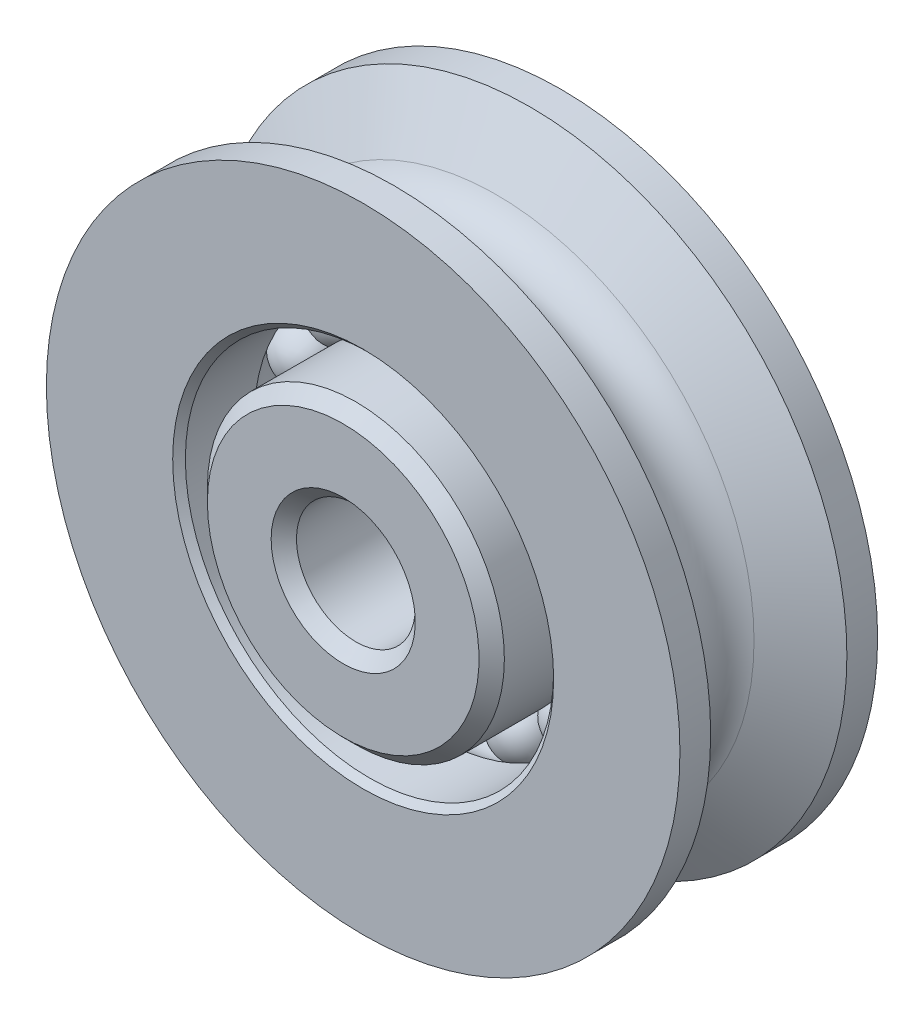
ISO-10303-21;
HEADER;
FILE_DESCRIPTION(('STEP AP214'),'2;1');
FILE_NAME('part.step','',(''),(''),'','','');
FILE_SCHEMA(('AUTOMOTIVE_DESIGN { 1 0 10303 214 1 1 1 1 }'));
ENDSEC;
DATA;
#1=APPLICATION_CONTEXT('core data for automotive mechanical design processes');
#2=APPLICATION_PROTOCOL_DEFINITION('international standard','automotive_design',2000,#1);
#3=PRODUCT_CONTEXT('',#1,'mechanical');
#4=PRODUCT('Part','Part','',(#3));
#5=PRODUCT_RELATED_PRODUCT_CATEGORY('part','',(#4));
#6=PRODUCT_DEFINITION_FORMATION('','',#4);
#7=PRODUCT_DEFINITION_CONTEXT('part definition',#1,'design');
#8=PRODUCT_DEFINITION('design','',#6,#7);
#9=PRODUCT_DEFINITION_SHAPE('','',#8);
#10=(LENGTH_UNIT() NAMED_UNIT(*) SI_UNIT(.MILLI.,.METRE.));
#11=(NAMED_UNIT(*) PLANE_ANGLE_UNIT() SI_UNIT($,.RADIAN.));
#12=(NAMED_UNIT(*) SI_UNIT($,.STERADIAN.) SOLID_ANGLE_UNIT());
#13=UNCERTAINTY_MEASURE_WITH_UNIT(LENGTH_MEASURE(1.E-05),#10,'distance_accuracy_value','');
#14=(GEOMETRIC_REPRESENTATION_CONTEXT(3) GLOBAL_UNCERTAINTY_ASSIGNED_CONTEXT((#13)) GLOBAL_UNIT_ASSIGNED_CONTEXT((#10,
#11,#12)) REPRESENTATION_CONTEXT('',''));
#15=CARTESIAN_POINT('',(0.,0.,0.));
#16=DIRECTION('',(0.,0.,1.));
#17=DIRECTION('',(1.,0.,0.));
#18=AXIS2_PLACEMENT_3D('',#15,#16,#17);
#19=CARTESIAN_POINT('',(2.55154178529415,6.15996678301904,0.));
#20=DIRECTION('',(0.382683432365077,0.923879532511292,0.));
#21=DIRECTION('',(0.,0.,-1.));
#22=AXIS2_PLACEMENT_3D('',#19,#20,#21);
#23=SPHERICAL_SURFACE('',#22,1.190625);
#24=CARTESIAN_POINT('',(3.00717424695382,7.2599608514153,0.));
#25=VERTEX_POINT('',#24);
#26=VERTEX_LOOP('',#25);
#27=FACE_BOUND('',#26,.T.);
#28=ADVANCED_FACE('F43',(#27),#23,.T.);
#29=CLOSED_SHELL('',(#28));
#30=MANIFOLD_SOLID_BREP('B2',#29);
#31=CARTESIAN_POINT('',(4.71463446356125,4.71463446356136,0.));
#32=DIRECTION('',(0.707106781186539,0.707106781186556,0.));
#33=DIRECTION('',(0.,0.,-1.));
#34=AXIS2_PLACEMENT_3D('',#31,#32,#33);
#35=SPHERICAL_SURFACE('',#34,1.190625);
#36=CARTESIAN_POINT('',(5.55653347491147,5.55653347491161,0.));
#37=VERTEX_POINT('',#36);
#38=VERTEX_LOOP('',#37);
#39=FACE_BOUND('',#38,.T.);
#40=ADVANCED_FACE('F61',(#39),#35,.T.);
#41=CLOSED_SHELL('',(#40));
#42=MANIFOLD_SOLID_BREP('B7',#41);
#43=CARTESIAN_POINT('',(6.15996678301898,2.5515417852943,0.));
#44=DIRECTION('',(0.923879532511283,0.3826834323651,0.));
#45=DIRECTION('',(0.,0.,-1.));
#46=AXIS2_PLACEMENT_3D('',#43,#44,#45);
#47=SPHERICAL_SURFACE('',#46,1.190625);
#48=CARTESIAN_POINT('',(7.25996085141522,3.007174246954,0.));
#49=VERTEX_POINT('',#48);
#50=VERTEX_LOOP('',#49);
#51=FACE_BOUND('',#50,.T.);
#52=ADVANCED_FACE('F79',(#51),#47,.T.);
#53=CLOSED_SHELL('',(#52));
#54=MANIFOLD_SOLID_BREP('B39',#53);
#55=CARTESIAN_POINT('',(6.6675,0.,0.));
#56=DIRECTION('',(1.,0.,0.));
#57=DIRECTION('',(0.,0.,-1.));
#58=AXIS2_PLACEMENT_3D('',#55,#56,#57);
#59=SPHERICAL_SURFACE('',#58,1.190625);
#60=CARTESIAN_POINT('',(7.858125,0.,0.));
#61=VERTEX_POINT('',#60);
#62=VERTEX_LOOP('',#61);
#63=FACE_BOUND('',#62,.T.);
#64=ADVANCED_FACE('F97',(#63),#59,.T.);
#65=CLOSED_SHELL('',(#64));
#66=MANIFOLD_SOLID_BREP('B57',#65);
#67=CARTESIAN_POINT('',(6.15996678301903,-2.55154178529417,0.));
#68=DIRECTION('',(0.923879532511291,-0.382683432365081,0.));
#69=DIRECTION('',(0.,0.,-1.));
#70=AXIS2_PLACEMENT_3D('',#67,#68,#69);
#71=SPHERICAL_SURFACE('',#70,1.190625);
#72=CARTESIAN_POINT('',(7.25996085141529,-3.00717424695385,0.));
#73=VERTEX_POINT('',#72);
#74=VERTEX_LOOP('',#73);
#75=FACE_BOUND('',#74,.T.);
#76=ADVANCED_FACE('F115',(#75),#71,.T.);
#77=CLOSED_SHELL('',(#76));
#78=MANIFOLD_SOLID_BREP('B75',#77);
#79=CARTESIAN_POINT('',(4.71463446356135,-4.71463446356126,0.));
#80=DIRECTION('',(0.707106781186554,-0.707106781186541,0.));
#81=DIRECTION('',(0.,0.,-1.));
#82=AXIS2_PLACEMENT_3D('',#79,#80,#81);
#83=SPHERICAL_SURFACE('',#82,1.190625);
#84=CARTESIAN_POINT('',(5.55653347491159,-5.55653347491149,0.));
#85=VERTEX_POINT('',#84);
#86=VERTEX_LOOP('',#85);
#87=FACE_BOUND('',#86,.T.);
#88=ADVANCED_FACE('F133',(#87),#83,.T.);
#89=CLOSED_SHELL('',(#88));
#90=MANIFOLD_SOLID_BREP('B93',#89);
#91=CARTESIAN_POINT('',(2.55154178529428,-6.15996678301898,0.));
#92=DIRECTION('',(0.382683432365097,-0.923879532511284,0.));
#93=DIRECTION('',(0.,0.,-1.));
#94=AXIS2_PLACEMENT_3D('',#91,#92,#93);
#95=SPHERICAL_SURFACE('',#94,1.190625);
#96=CARTESIAN_POINT('',(3.00717424695398,-7.25996085141523,0.));
#97=VERTEX_POINT('',#96);
#98=VERTEX_LOOP('',#97);
#99=FACE_BOUND('',#98,.T.);
#100=ADVANCED_FACE('F151',(#99),#95,.T.);
#101=CLOSED_SHELL('',(#100));
#102=MANIFOLD_SOLID_BREP('B111',#101);
#103=CARTESIAN_POINT('',(0.,-6.6675,0.));
#104=DIRECTION('',(0.,-1.,0.));
#105=DIRECTION('',(0.,0.,-1.));
#106=AXIS2_PLACEMENT_3D('',#103,#104,#105);
#107=SPHERICAL_SURFACE('',#106,1.190625);
#108=CARTESIAN_POINT('',(0.,-7.858125,0.));
#109=VERTEX_POINT('',#108);
#110=VERTEX_LOOP('',#109);
#111=FACE_BOUND('',#110,.T.);
#112=ADVANCED_FACE('F169',(#111),#107,.T.);
#113=CLOSED_SHELL('',(#112));
#114=MANIFOLD_SOLID_BREP('B129',#113);
#115=CARTESIAN_POINT('',(-2.5515417852942,-6.15996678301902,0.));
#116=DIRECTION('',(-0.382683432365084,-0.923879532511289,0.));
#117=DIRECTION('',(0.,0.,-1.));
#118=AXIS2_PLACEMENT_3D('',#115,#116,#117);
#119=SPHERICAL_SURFACE('',#118,1.190625);
#120=CARTESIAN_POINT('',(-3.00717424695388,-7.25996085141527,0.));
#121=VERTEX_POINT('',#120);
#122=VERTEX_LOOP('',#121);
#123=FACE_BOUND('',#122,.T.);
#124=ADVANCED_FACE('F187',(#123),#119,.T.);
#125=CLOSED_SHELL('',(#124));
#126=MANIFOLD_SOLID_BREP('B147',#125);
#127=CARTESIAN_POINT('',(-4.71463446356128,-4.71463446356133,0.));
#128=DIRECTION('',(-0.707106781186544,-0.707106781186551,0.));
#129=DIRECTION('',(0.,0.,-1.));
#130=AXIS2_PLACEMENT_3D('',#127,#128,#129);
#131=SPHERICAL_SURFACE('',#130,1.190625);
#132=CARTESIAN_POINT('',(-5.55653347491151,-5.55653347491157,0.));
#133=VERTEX_POINT('',#132);
#134=VERTEX_LOOP('',#133);
#135=FACE_BOUND('',#134,.T.);
#136=ADVANCED_FACE('F205',(#135),#131,.T.);
#137=CLOSED_SHELL('',(#136));
#138=MANIFOLD_SOLID_BREP('B165',#137);
#139=CARTESIAN_POINT('',(-6.15996678301899,-2.55154178529426,0.));
#140=DIRECTION('',(-0.923879532511285,-0.382683432365094,0.));
#141=DIRECTION('',(0.,0.,-1.));
#142=AXIS2_PLACEMENT_3D('',#139,#140,#141);
#143=SPHERICAL_SURFACE('',#142,1.190625);
#144=CARTESIAN_POINT('',(-7.25996085141524,-3.00717424695395,0.));
#145=VERTEX_POINT('',#144);
#146=VERTEX_LOOP('',#145);
#147=FACE_BOUND('',#146,.T.);
#148=ADVANCED_FACE('F223',(#147),#143,.T.);
#149=CLOSED_SHELL('',(#148));
#150=MANIFOLD_SOLID_BREP('B183',#149);
#151=CARTESIAN_POINT('',(-6.6675,0.,0.));
#152=DIRECTION('',(-1.,0.,0.));
#153=DIRECTION('',(0.,0.,-1.));
#154=AXIS2_PLACEMENT_3D('',#151,#152,#153);
#155=SPHERICAL_SURFACE('',#154,1.190625);
#156=CARTESIAN_POINT('',(-7.858125,0.,0.));
#157=VERTEX_POINT('',#156);
#158=VERTEX_LOOP('',#157);
#159=FACE_BOUND('',#158,.T.);
#160=ADVANCED_FACE('F241',(#159),#155,.T.);
#161=CLOSED_SHELL('',(#160));
#162=MANIFOLD_SOLID_BREP('B201',#161);
#163=CARTESIAN_POINT('',(-6.15996678301901,2.55154178529422,0.));
#164=DIRECTION('',(-0.923879532511288,0.382683432365087,0.));
#165=DIRECTION('',(0.,0.,-1.));
#166=AXIS2_PLACEMENT_3D('',#163,#164,#165);
#167=SPHERICAL_SURFACE('',#166,1.190625);
#168=CARTESIAN_POINT('',(-7.25996085141526,3.0071742469539,0.));
#169=VERTEX_POINT('',#168);
#170=VERTEX_LOOP('',#169);
#171=FACE_BOUND('',#170,.T.);
#172=ADVANCED_FACE('F259',(#171),#167,.T.);
#173=CLOSED_SHELL('',(#172));
#174=MANIFOLD_SOLID_BREP('B219',#173);
#175=CARTESIAN_POINT('',(-4.71463446356131,4.7146344635613,0.));
#176=DIRECTION('',(-0.707106781186549,0.707106781186546,0.));
#177=DIRECTION('',(0.,0.,-1.));
#178=AXIS2_PLACEMENT_3D('',#175,#176,#177);
#179=SPHERICAL_SURFACE('',#178,1.190625);
#180=CARTESIAN_POINT('',(-5.55653347491155,5.55653347491153,0.));
#181=VERTEX_POINT('',#180);
#182=VERTEX_LOOP('',#181);
#183=FACE_BOUND('',#182,.T.);
#184=ADVANCED_FACE('F277',(#183),#179,.T.);
#185=CLOSED_SHELL('',(#184));
#186=MANIFOLD_SOLID_BREP('B237',#185);
#187=CARTESIAN_POINT('',(-2.55154178529424,6.159966783019,0.));
#188=DIRECTION('',(-0.382683432365091,0.923879532511287,0.));
#189=DIRECTION('',(0.,0.,-1.));
#190=AXIS2_PLACEMENT_3D('',#187,#188,#189);
#191=SPHERICAL_SURFACE('',#190,1.190625);
#192=CARTESIAN_POINT('',(-3.00717424695393,7.25996085141525,0.));
#193=VERTEX_POINT('',#192);
#194=VERTEX_LOOP('',#193);
#195=FACE_BOUND('',#194,.T.);
#196=ADVANCED_FACE('F295',(#195),#191,.T.);
#197=CLOSED_SHELL('',(#196));
#198=MANIFOLD_SOLID_BREP('B255',#197);
#199=CARTESIAN_POINT('',(0.,6.6675,0.));
#200=DIRECTION('',(0.,1.,0.));
#201=DIRECTION('',(0.,0.,-1.));
#202=AXIS2_PLACEMENT_3D('',#199,#200,#201);
#203=SPHERICAL_SURFACE('',#202,1.190625);
#204=CARTESIAN_POINT('',(0.,7.858125,0.));
#205=VERTEX_POINT('',#204);
#206=VERTEX_LOOP('',#205);
#207=FACE_BOUND('',#206,.T.);
#208=ADVANCED_FACE('F315',(#207),#203,.T.);
#209=CLOSED_SHELL('',(#208));
#210=MANIFOLD_SOLID_BREP('B273',#209);
#211=CARTESIAN_POINT('',(0.,5.953125,4.7625));
#212=DIRECTION('',(0.,0.,-1.));
#213=DIRECTION('',(-1.,0.,0.));
#214=AXIS2_PLACEMENT_3D('',#211,#212,#213);
#215=PLANE('',#214);
#216=CARTESIAN_POINT('',(0.,0.,4.7625));
#217=DIRECTION('',(0.,0.,-1.));
#218=DIRECTION('',(-1.,0.,0.));
#219=AXIS2_PLACEMENT_3D('',#216,#217,#218);
#220=CIRCLE('',#219,5.445125);
#221=CARTESIAN_POINT('',(-5.445125,0.,4.7625));
#222=VERTEX_POINT('',#221);
#223=EDGE_CURVE('E341',#222,#222,#220,.F.);
#224=ORIENTED_EDGE('',*,*,#223,.T.);
#225=EDGE_LOOP('',(#224));
#226=FACE_BOUND('',#225,.T.);
#227=CARTESIAN_POINT('',(0.,0.,4.7625));
#228=DIRECTION('',(0.,0.,-1.));
#229=DIRECTION('',(-1.,0.,0.));
#230=AXIS2_PLACEMENT_3D('',#227,#228,#229);
#231=CIRCLE('',#230,2.88925);
#232=CARTESIAN_POINT('',(-2.88925,0.,4.7625));
#233=VERTEX_POINT('',#232);
#234=EDGE_CURVE('E345',#233,#233,#231,.T.);
#235=ORIENTED_EDGE('',*,*,#234,.T.);
#236=EDGE_LOOP('',(#235));
#237=FACE_BOUND('',#236,.T.);
#238=ADVANCED_FACE('F334',(#226,#237),#215,.F.);
#239=CARTESIAN_POINT('',(0.,0.,4.7625));
#240=DIRECTION('',(0.,0.,1.));
#241=DIRECTION('',(1.,0.,0.));
#242=AXIS2_PLACEMENT_3D('',#239,#240,#241);
#243=CYLINDRICAL_SURFACE('',#242,2.38125);
#244=CARTESIAN_POINT('',(0.,0.,-4.2545));
#245=DIRECTION('',(0.,0.,1.));
#246=DIRECTION('',(1.,0.,0.));
#247=AXIS2_PLACEMENT_3D('',#244,#245,#246);
#248=CIRCLE('',#247,2.38125);
#249=CARTESIAN_POINT('',(2.38125,0.,-4.2545));
#250=VERTEX_POINT('',#249);
#251=EDGE_CURVE('E354',#250,#250,#248,.F.);
#252=ORIENTED_EDGE('',*,*,#251,.T.);
#253=EDGE_LOOP('',(#252));
#254=FACE_BOUND('',#253,.T.);
#255=CARTESIAN_POINT('',(0.,0.,4.2545));
#256=DIRECTION('',(0.,0.,-1.));
#257=DIRECTION('',(-1.,0.,0.));
#258=AXIS2_PLACEMENT_3D('',#255,#256,#257);
#259=CIRCLE('',#258,2.38125);
#260=CARTESIAN_POINT('',(-2.38125,0.,4.2545));
#261=VERTEX_POINT('',#260);
#262=EDGE_CURVE('E357',#261,#261,#259,.F.);
#263=ORIENTED_EDGE('',*,*,#262,.T.);
#264=EDGE_LOOP('',(#263));
#265=FACE_BOUND('',#264,.T.);
#266=ADVANCED_FACE('F389',(#254,#265),#243,.F.);
#267=CARTESIAN_POINT('',(0.,5.953125,-4.7625));
#268=DIRECTION('',(0.,0.,1.));
#269=DIRECTION('',(1.,0.,0.));
#270=AXIS2_PLACEMENT_3D('',#267,#268,#269);
#271=PLANE('',#270);
#272=CARTESIAN_POINT('',(0.,0.,-4.7625));
#273=DIRECTION('',(0.,0.,1.));
#274=DIRECTION('',(1.,0.,0.));
#275=AXIS2_PLACEMENT_3D('',#272,#273,#274);
#276=CIRCLE('',#275,2.88925);
#277=CARTESIAN_POINT('',(2.88925,0.,-4.7625));
#278=VERTEX_POINT('',#277);
#279=EDGE_CURVE('E360',#278,#278,#276,.T.);
#280=ORIENTED_EDGE('',*,*,#279,.T.);
#281=EDGE_LOOP('',(#280));
#282=FACE_BOUND('',#281,.T.);
#283=CARTESIAN_POINT('',(0.,0.,-4.7625));
#284=DIRECTION('',(0.,0.,1.));
#285=DIRECTION('',(1.,0.,0.));
#286=AXIS2_PLACEMENT_3D('',#283,#284,#285);
#287=CIRCLE('',#286,5.445125);
#288=CARTESIAN_POINT('',(5.445125,0.,-4.7625));
#289=VERTEX_POINT('',#288);
#290=EDGE_CURVE('E363',#289,#289,#287,.F.);
#291=ORIENTED_EDGE('',*,*,#290,.T.);
#292=EDGE_LOOP('',(#291));
#293=FACE_BOUND('',#292,.T.);
#294=ADVANCED_FACE('F383',(#282,#293),#271,.F.);
#295=CARTESIAN_POINT('',(0.,0.,4.7625));
#296=DIRECTION('',(0.,0.,1.));
#297=DIRECTION('',(1.,0.,0.));
#298=AXIS2_PLACEMENT_3D('',#295,#296,#297);
#299=CYLINDRICAL_SURFACE('',#298,5.953125);
#300=CARTESIAN_POINT('',(0.,0.,-4.2545));
#301=DIRECTION('',(0.,0.,1.));
#302=DIRECTION('',(1.,0.,0.));
#303=AXIS2_PLACEMENT_3D('',#300,#301,#302);
#304=CIRCLE('',#303,5.953125);
#305=CARTESIAN_POINT('',(5.953125,0.,-4.2545));
#306=VERTEX_POINT('',#305);
#307=EDGE_CURVE('E349',#306,#306,#304,.T.);
#308=ORIENTED_EDGE('',*,*,#307,.T.);
#309=EDGE_LOOP('',(#308));
#310=FACE_BOUND('',#309,.T.);
#311=CARTESIAN_POINT('',(0.,0.,-0.9525));
#312=DIRECTION('',(0.,0.,1.));
#313=DIRECTION('',(1.,0.,0.));
#314=AXIS2_PLACEMENT_3D('',#311,#312,#313);
#315=CIRCLE('',#314,5.953125);
#316=CARTESIAN_POINT('',(5.953125,0.,-0.9525));
#317=VERTEX_POINT('',#316);
#318=EDGE_CURVE('E366',#317,#317,#315,.T.);
#319=ORIENTED_EDGE('',*,*,#318,.F.);
#320=EDGE_LOOP('',(#319));
#321=FACE_BOUND('',#320,.T.);
#322=ADVANCED_FACE('F378',(#310,#321),#299,.T.);
#323=CARTESIAN_POINT('',(0.,0.,0.));
#324=DIRECTION('',(0.,0.,1.));
#325=DIRECTION('',(1.,0.,0.));
#326=AXIS2_PLACEMENT_3D('',#323,#324,#325);
#327=TOROIDAL_SURFACE('',#326,6.6675,1.190625);
#328=CARTESIAN_POINT('',(0.,0.,0.9525));
#329=DIRECTION('',(0.,0.,1.));
#330=DIRECTION('',(1.,0.,0.));
#331=AXIS2_PLACEMENT_3D('',#328,#329,#330);
#332=CIRCLE('',#331,5.953125);
#333=CARTESIAN_POINT('',(5.953125,0.,0.9525));
#334=VERTEX_POINT('',#333);
#335=EDGE_CURVE('E369',#334,#334,#332,.T.);
#336=ORIENTED_EDGE('',*,*,#335,.F.);
#337=EDGE_LOOP('',(#336));
#338=FACE_BOUND('',#337,.T.);
#339=ORIENTED_EDGE('',*,*,#318,.T.);
#340=EDGE_LOOP('',(#339));
#341=FACE_BOUND('',#340,.T.);
#342=ADVANCED_FACE('F375',(#338,#341),#327,.F.);
#343=CARTESIAN_POINT('',(0.,0.,4.7625));
#344=DIRECTION('',(0.,0.,1.));
#345=DIRECTION('',(1.,0.,0.));
#346=AXIS2_PLACEMENT_3D('',#343,#344,#345);
#347=CYLINDRICAL_SURFACE('',#346,5.953125);
#348=CARTESIAN_POINT('',(0.,0.,4.2545));
#349=DIRECTION('',(0.,0.,-1.));
#350=DIRECTION('',(-1.,0.,0.));
#351=AXIS2_PLACEMENT_3D('',#348,#349,#350);
#352=CIRCLE('',#351,5.953125);
#353=CARTESIAN_POINT('',(-5.953125,0.,4.2545));
#354=VERTEX_POINT('',#353);
#355=EDGE_CURVE('E314',#354,#354,#352,.T.);
#356=ORIENTED_EDGE('',*,*,#355,.T.);
#357=EDGE_LOOP('',(#356));
#358=FACE_BOUND('',#357,.T.);
#359=ORIENTED_EDGE('',*,*,#335,.T.);
#360=EDGE_LOOP('',(#359));
#361=FACE_BOUND('',#360,.T.);
#362=ADVANCED_FACE('F373',(#358,#361),#347,.T.);
#363=CARTESIAN_POINT('',(0.,0.,-4.7625));
#364=DIRECTION('',(0.,0.,-1.));
#365=DIRECTION('',(-1.,0.,0.));
#366=AXIS2_PLACEMENT_3D('',#363,#364,#365);
#367=CONICAL_SURFACE('',#366,2.88925,0.785398163397443);
#368=ORIENTED_EDGE('',*,*,#251,.F.);
#369=EDGE_LOOP('',(#368));
#370=FACE_BOUND('',#369,.T.);
#371=ORIENTED_EDGE('',*,*,#279,.F.);
#372=EDGE_LOOP('',(#371));
#373=FACE_BOUND('',#372,.T.);
#374=ADVANCED_FACE('F401',(#370,#373),#367,.F.);
#375=CARTESIAN_POINT('',(0.,0.,-4.2545));
#376=DIRECTION('',(0.,0.,1.));
#377=DIRECTION('',(1.,0.,0.));
#378=AXIS2_PLACEMENT_3D('',#375,#376,#377);
#379=CONICAL_SURFACE('',#378,5.953125,0.785398163397451);
#380=ORIENTED_EDGE('',*,*,#290,.F.);
#381=EDGE_LOOP('',(#380));
#382=FACE_BOUND('',#381,.T.);
#383=ORIENTED_EDGE('',*,*,#307,.F.);
#384=EDGE_LOOP('',(#383));
#385=FACE_BOUND('',#384,.T.);
#386=ADVANCED_FACE('F404',(#382,#385),#379,.T.);
#387=CARTESIAN_POINT('',(0.,0.,4.7625));
#388=DIRECTION('',(0.,0.,-1.));
#389=DIRECTION('',(-1.,0.,0.));
#390=AXIS2_PLACEMENT_3D('',#387,#388,#389);
#391=CONICAL_SURFACE('',#390,5.445125,0.785398163397444);
#392=CARTESIAN_POINT('',(-5.953125,0.,4.2545));
#393=CARTESIAN_POINT('',(-5.94783333333333,0.,4.25979166666666));
#394=CARTESIAN_POINT('',(-5.94254166666667,0.,4.26508333333333));
#395=CARTESIAN_POINT('',(-5.93195833333333,0.,4.27566666666666));
#396=CARTESIAN_POINT('',(-5.92666666666667,0.,4.28095833333333));
#397=CARTESIAN_POINT('',(-5.91608333333333,0.,4.29154166666666));
#398=CARTESIAN_POINT('',(-5.91079166666667,0.,4.29683333333333));
#399=CARTESIAN_POINT('',(-5.90020833333333,0.,4.30741666666666));
#400=CARTESIAN_POINT('',(-5.89491666666667,0.,4.31270833333333));
#401=CARTESIAN_POINT('',(-5.88433333333333,0.,4.32329166666666));
#402=CARTESIAN_POINT('',(-5.87904166666667,0.,4.32858333333333));
#403=CARTESIAN_POINT('',(-5.86845833333333,0.,4.33916666666666));
#404=CARTESIAN_POINT('',(-5.86316666666667,0.,4.34445833333333));
#405=CARTESIAN_POINT('',(-5.85258333333333,0.,4.35504166666666));
#406=CARTESIAN_POINT('',(-5.84729166666667,0.,4.36033333333333));
#407=CARTESIAN_POINT('',(-5.83670833333333,0.,4.37091666666666));
#408=CARTESIAN_POINT('',(-5.83141666666667,0.,4.37620833333333));
#409=CARTESIAN_POINT('',(-5.82083333333333,0.,4.38679166666666));
#410=CARTESIAN_POINT('',(-5.81554166666667,0.,4.39208333333333));
#411=CARTESIAN_POINT('',(-5.80495833333333,0.,4.40266666666666));
#412=CARTESIAN_POINT('',(-5.79966666666667,0.,4.40795833333333));
#413=CARTESIAN_POINT('',(-5.78908333333333,0.,4.41854166666667));
#414=CARTESIAN_POINT('',(-5.78379166666667,0.,4.42383333333333));
#415=CARTESIAN_POINT('',(-5.77320833333333,0.,4.43441666666667));
#416=CARTESIAN_POINT('',(-5.76791666666667,0.,4.43970833333333));
#417=CARTESIAN_POINT('',(-5.75733333333333,0.,4.45029166666667));
#418=CARTESIAN_POINT('',(-5.75204166666667,0.,4.45558333333333));
#419=CARTESIAN_POINT('',(-5.74145833333333,0.,4.46616666666667));
#420=CARTESIAN_POINT('',(-5.73616666666667,0.,4.47145833333333));
#421=CARTESIAN_POINT('',(-5.72558333333333,0.,4.48204166666667));
#422=CARTESIAN_POINT('',(-5.72029166666667,0.,4.48733333333333));
#423=CARTESIAN_POINT('',(-5.70970833333333,0.,4.49791666666667));
#424=CARTESIAN_POINT('',(-5.70441666666667,0.,4.50320833333333));
#425=CARTESIAN_POINT('',(-5.69383333333333,0.,4.51379166666667));
#426=CARTESIAN_POINT('',(-5.68854166666667,0.,4.51908333333333));
#427=CARTESIAN_POINT('',(-5.67795833333333,0.,4.52966666666667));
#428=CARTESIAN_POINT('',(-5.67266666666667,0.,4.53495833333333));
#429=CARTESIAN_POINT('',(-5.66208333333333,0.,4.54554166666667));
#430=CARTESIAN_POINT('',(-5.65679166666667,0.,4.55083333333333));
#431=CARTESIAN_POINT('',(-5.64620833333333,0.,4.56141666666667));
#432=CARTESIAN_POINT('',(-5.64091666666667,0.,4.56670833333333));
#433=CARTESIAN_POINT('',(-5.63033333333333,0.,4.57729166666667));
#434=CARTESIAN_POINT('',(-5.62504166666667,0.,4.58258333333333));
#435=CARTESIAN_POINT('',(-5.61445833333333,0.,4.59316666666667));
#436=CARTESIAN_POINT('',(-5.60916666666667,0.,4.59845833333333));
#437=CARTESIAN_POINT('',(-5.59858333333333,0.,4.60904166666667));
#438=CARTESIAN_POINT('',(-5.59329166666667,0.,4.61433333333333));
#439=CARTESIAN_POINT('',(-5.58270833333333,0.,4.62491666666667));
#440=CARTESIAN_POINT('',(-5.57741666666667,0.,4.63020833333333));
#441=CARTESIAN_POINT('',(-5.56683333333333,0.,4.64079166666667));
#442=CARTESIAN_POINT('',(-5.56154166666667,0.,4.64608333333333));
#443=CARTESIAN_POINT('',(-5.55095833333333,0.,4.65666666666667));
#444=CARTESIAN_POINT('',(-5.54566666666667,0.,4.66195833333333));
#445=CARTESIAN_POINT('',(-5.53508333333333,0.,4.67254166666667));
#446=CARTESIAN_POINT('',(-5.52979166666667,0.,4.67783333333333));
#447=CARTESIAN_POINT('',(-5.51920833333333,0.,4.68841666666667));
#448=CARTESIAN_POINT('',(-5.51391666666667,0.,4.69370833333333));
#449=CARTESIAN_POINT('',(-5.50333333333333,0.,4.70429166666667));
#450=CARTESIAN_POINT('',(-5.49804166666667,0.,4.70958333333333));
#451=CARTESIAN_POINT('',(-5.48745833333333,0.,4.72016666666667));
#452=CARTESIAN_POINT('',(-5.48216666666667,0.,4.72545833333333));
#453=CARTESIAN_POINT('',(-5.47158333333333,0.,4.73604166666667));
#454=CARTESIAN_POINT('',(-5.46629166666667,0.,4.74133333333334));
#455=CARTESIAN_POINT('',(-5.45570833333333,0.,4.75191666666667));
#456=CARTESIAN_POINT('',(-5.45041666666667,0.,4.75720833333333));
#457=CARTESIAN_POINT('',(-5.445125,0.,4.7625));
#458=B_SPLINE_CURVE_WITH_KNOTS('',3,(#392,#393,#394,#395,#396,#397,#398,#399,#400,#401,#402,
#403,#404,#405,#406,#407,#408,#409,#410,#411,#412,#413,#414,#415,#416,#417,#418,#419,#420,#421,
#422,#423,#424,#425,#426,#427,#428,#429,#430,#431,#432,#433,#434,#435,#436,#437,#438,#439,#440,
#441,#442,#443,#444,#445,#446,#447,#448,#449,#450,#451,#452,#453,#454,#455,#456,#457),
.UNSPECIFIED.,.F.,.F.,(4,2,2,2,2,2,2,2,2,2,2,2,2,2,2,2,2,2,2,2,2,2,2,2,2,2,2,2,2,2,2,2,4),(0.,
0.0224506403026733,0.0449012806053465,0.0673519209080192,0.0898025612106924,0.112253201513366,
0.134703841816038,0.157154482118711,0.179605122421384,0.202055762724057,0.22450640302673,
0.246957043329403,0.269407683632077,0.291858323934749,0.314308964237422,0.336759604540095,
0.359210244842768,0.381660885145441,0.404111525448114,0.426562165750786,0.44901280605346,
0.471463446356133,0.493914086658806,0.516364726961479,0.538815367264152,0.561266007566825,
0.583716647869497,0.606167288172171,0.628617928474844,0.651068568777517,0.67351920908019,
0.695969849382863,0.718420489685535),.UNSPECIFIED.);
#459=EDGE_CURVE('BSEAM407',#354,#222,#458,.T.);
#460=ORIENTED_EDGE('',*,*,#355,.F.);
#461=ORIENTED_EDGE('',*,*,#223,.F.);
#462=ORIENTED_EDGE('',*,*,#459,.T.);
#463=ORIENTED_EDGE('',*,*,#459,.F.);
#464=EDGE_LOOP('',(#460,#462,#461,#463));
#465=FACE_BOUND('',#464,.T.);
#466=ADVANCED_FACE('F407',(#465),#391,.T.);
#467=CARTESIAN_POINT('',(0.,0.,4.2545));
#468=DIRECTION('',(0.,0.,1.));
#469=DIRECTION('',(1.,0.,0.));
#470=AXIS2_PLACEMENT_3D('',#467,#468,#469);
#471=CONICAL_SURFACE('',#470,2.38125,0.785398163397448);
#472=ORIENTED_EDGE('',*,*,#234,.F.);
#473=EDGE_LOOP('',(#472));
#474=FACE_BOUND('',#473,.T.);
#475=ORIENTED_EDGE('',*,*,#262,.F.);
#476=EDGE_LOOP('',(#475));
#477=FACE_BOUND('',#476,.T.);
#478=ADVANCED_FACE('F336',(#474,#477),#471,.F.);
#479=CLOSED_SHELL('',(#238,#266,#294,#322,#342,#362,#374,#386,#466,#478));
#480=MANIFOLD_SOLID_BREP('B291',#479);
#481=CARTESIAN_POINT('',(0.,0.,0.));
#482=DIRECTION('',(0.,0.,1.));
#483=DIRECTION('',(1.,0.,0.));
#484=AXIS2_PLACEMENT_3D('',#481,#482,#483);
#485=TOROIDAL_SURFACE('',#484,11.1125,1.5875);
#486=CARTESIAN_POINT('',(0.,0.,1.37959781729992));
#487=DIRECTION('',(0.,0.,1.));
#488=DIRECTION('',(1.,0.,0.));
#489=AXIS2_PLACEMENT_3D('',#486,#487,#488);
#490=CIRCLE('',#489,10.3270917542441);
#491=CARTESIAN_POINT('',(10.3270917542441,0.,1.37959781729992));
#492=VERTEX_POINT('',#491);
#493=EDGE_CURVE('E505',#492,#492,#490,.T.);
#494=ORIENTED_EDGE('',*,*,#493,.F.);
#495=EDGE_LOOP('',(#494));
#496=FACE_BOUND('',#495,.T.);
#497=CARTESIAN_POINT('',(0.,0.,-1.37959781729992));
#498=DIRECTION('',(0.,0.,1.));
#499=DIRECTION('',(1.,0.,0.));
#500=AXIS2_PLACEMENT_3D('',#497,#498,#499);
#501=CIRCLE('',#500,10.3270917542441);
#502=CARTESIAN_POINT('',(10.3270917542441,0.,-1.37959781729992));
#503=VERTEX_POINT('',#502);
#504=EDGE_CURVE('E526',#503,#503,#501,.T.);
#505=ORIENTED_EDGE('',*,*,#504,.T.);
#506=EDGE_LOOP('',(#505));
#507=FACE_BOUND('',#506,.T.);
#508=ADVANCED_FACE('F485',(#496,#507),#485,.F.);
#509=CARTESIAN_POINT('',(0.,0.,1.37959781729992));
#510=DIRECTION('',(0.,0.,1.));
#511=DIRECTION('',(1.,0.,0.));
#512=AXIS2_PLACEMENT_3D('',#509,#510,#511);
#513=CONICAL_SURFACE('',#512,10.3270917542441,1.0532545428675);
#514=CARTESIAN_POINT('',(0.,0.,2.7305));
#515=DIRECTION('',(0.,0.,1.));
#516=DIRECTION('',(1.,0.,0.));
#517=AXIS2_PLACEMENT_3D('',#514,#515,#516);
#518=CIRCLE('',#517,12.7);
#519=CARTESIAN_POINT('',(12.7,0.,2.7305));
#520=VERTEX_POINT('',#519);
#521=EDGE_CURVE('E508',#520,#520,#518,.T.);
#522=ORIENTED_EDGE('',*,*,#521,.F.);
#523=EDGE_LOOP('',(#522));
#524=FACE_BOUND('',#523,.T.);
#525=ORIENTED_EDGE('',*,*,#493,.T.);
#526=EDGE_LOOP('',(#525));
#527=FACE_BOUND('',#526,.T.);
#528=ADVANCED_FACE('F556',(#524,#527),#513,.T.);
#529=CARTESIAN_POINT('',(0.,0.,4.7625));
#530=DIRECTION('',(0.,0.,1.));
#531=DIRECTION('',(1.,0.,0.));
#532=AXIS2_PLACEMENT_3D('',#529,#530,#531);
#533=CYLINDRICAL_SURFACE('',#532,12.7);
#534=CARTESIAN_POINT('',(0.,0.,3.9624));
#535=DIRECTION('',(0.,0.,1.));
#536=DIRECTION('',(1.,0.,0.));
#537=AXIS2_PLACEMENT_3D('',#534,#535,#536);
#538=CIRCLE('',#537,12.7);
#539=CARTESIAN_POINT('',(12.7,0.,3.9624));
#540=VERTEX_POINT('',#539);
#541=EDGE_CURVE('E511',#540,#540,#538,.T.);
#542=ORIENTED_EDGE('',*,*,#541,.F.);
#543=EDGE_LOOP('',(#542));
#544=FACE_BOUND('',#543,.T.);
#545=ORIENTED_EDGE('',*,*,#521,.T.);
#546=EDGE_LOOP('',(#545));
#547=FACE_BOUND('',#546,.T.);
#548=ADVANCED_FACE('F562',(#544,#547),#533,.T.);
#549=CARTESIAN_POINT('',(0.,7.381875,3.9624));
#550=DIRECTION('',(0.,0.,-1.));
#551=DIRECTION('',(-1.,0.,0.));
#552=AXIS2_PLACEMENT_3D('',#549,#550,#551);
#553=PLANE('',#552);
#554=CARTESIAN_POINT('',(0.,0.,3.9624));
#555=DIRECTION('',(0.,0.,-1.));
#556=DIRECTION('',(-1.,0.,0.));
#557=AXIS2_PLACEMENT_3D('',#554,#555,#556);
#558=CIRCLE('',#557,7.63587500000001);
#559=CARTESIAN_POINT('',(-7.63587500000001,0.,3.9624));
#560=VERTEX_POINT('',#559);
#561=EDGE_CURVE('E333',#560,#560,#558,.T.);
#562=ORIENTED_EDGE('',*,*,#561,.T.);
#563=EDGE_LOOP('',(#562));
#564=FACE_BOUND('',#563,.T.);
#565=ORIENTED_EDGE('',*,*,#541,.T.);
#566=EDGE_LOOP('',(#565));
#567=FACE_BOUND('',#566,.T.);
#568=ADVANCED_FACE('F586',(#564,#567),#553,.F.);
#569=CARTESIAN_POINT('',(0.,0.,4.7625));
#570=DIRECTION('',(0.,0.,1.));
#571=DIRECTION('',(1.,0.,0.));
#572=AXIS2_PLACEMENT_3D('',#569,#570,#571);
#573=CYLINDRICAL_SURFACE('',#572,7.381875);
#574=CARTESIAN_POINT('',(0.,0.,3.70839999999999));
#575=DIRECTION('',(0.,0.,-1.));
#576=DIRECTION('',(-1.,0.,0.));
#577=AXIS2_PLACEMENT_3D('',#574,#575,#576);
#578=CIRCLE('',#577,7.381875);
#579=CARTESIAN_POINT('',(-7.381875,0.,3.70839999999999));
#580=VERTEX_POINT('',#579);
#581=EDGE_CURVE('E492',#580,#580,#578,.F.);
#582=ORIENTED_EDGE('',*,*,#581,.T.);
#583=EDGE_LOOP('',(#582));
#584=FACE_BOUND('',#583,.T.);
#585=CARTESIAN_POINT('',(0.,0.,0.9525));
#586=DIRECTION('',(0.,0.,1.));
#587=DIRECTION('',(1.,0.,0.));
#588=AXIS2_PLACEMENT_3D('',#585,#586,#587);
#589=CIRCLE('',#588,7.381875);
#590=CARTESIAN_POINT('',(7.381875,0.,0.9525));
#591=VERTEX_POINT('',#590);
#592=EDGE_CURVE('E514',#591,#591,#589,.T.);
#593=ORIENTED_EDGE('',*,*,#592,.F.);
#594=EDGE_LOOP('',(#593));
#595=FACE_BOUND('',#594,.T.);
#596=ADVANCED_FACE('F581',(#584,#595),#573,.F.);
#597=CARTESIAN_POINT('',(0.,0.,0.));
#598=DIRECTION('',(0.,0.,1.));
#599=DIRECTION('',(1.,0.,0.));
#600=AXIS2_PLACEMENT_3D('',#597,#598,#599);
#601=TOROIDAL_SURFACE('',#600,6.6675,1.190625);
#602=CARTESIAN_POINT('',(0.,0.,-0.9525));
#603=DIRECTION('',(0.,0.,1.));
#604=DIRECTION('',(1.,0.,0.));
#605=AXIS2_PLACEMENT_3D('',#602,#603,#604);
#606=CIRCLE('',#605,7.381875);
#607=CARTESIAN_POINT('',(7.381875,0.,-0.9525));
#608=VERTEX_POINT('',#607);
#609=EDGE_CURVE('E517',#608,#608,#606,.T.);
#610=ORIENTED_EDGE('',*,*,#609,.F.);
#611=EDGE_LOOP('',(#610));
#612=FACE_BOUND('',#611,.T.);
#613=ORIENTED_EDGE('',*,*,#592,.T.);
#614=EDGE_LOOP('',(#613));
#615=FACE_BOUND('',#614,.T.);
#616=ADVANCED_FACE('F552',(#612,#615),#601,.F.);
#617=CARTESIAN_POINT('',(0.,0.,4.7625));
#618=DIRECTION('',(0.,0.,1.));
#619=DIRECTION('',(1.,0.,0.));
#620=AXIS2_PLACEMENT_3D('',#617,#618,#619);
#621=CYLINDRICAL_SURFACE('',#620,7.381875);
#622=CARTESIAN_POINT('',(0.,0.,-3.7084));
#623=DIRECTION('',(0.,0.,1.));
#624=DIRECTION('',(1.,0.,0.));
#625=AXIS2_PLACEMENT_3D('',#622,#623,#624);
#626=CIRCLE('',#625,7.381875);
#627=CARTESIAN_POINT('',(7.381875,0.,-3.7084));
#628=VERTEX_POINT('',#627);
#629=EDGE_CURVE('E496',#628,#628,#626,.F.);
#630=ORIENTED_EDGE('',*,*,#629,.T.);
#631=EDGE_LOOP('',(#630));
#632=FACE_BOUND('',#631,.T.);
#633=ORIENTED_EDGE('',*,*,#609,.T.);
#634=EDGE_LOOP('',(#633));
#635=FACE_BOUND('',#634,.T.);
#636=ADVANCED_FACE('F546',(#632,#635),#621,.F.);
#637=CARTESIAN_POINT('',(0.,12.7,-3.9624));
#638=DIRECTION('',(0.,0.,1.));
#639=DIRECTION('',(1.,0.,0.));
#640=AXIS2_PLACEMENT_3D('',#637,#638,#639);
#641=PLANE('',#640);
#642=CARTESIAN_POINT('',(0.,0.,-3.9624));
#643=DIRECTION('',(0.,0.,1.));
#644=DIRECTION('',(1.,0.,0.));
#645=AXIS2_PLACEMENT_3D('',#642,#643,#644);
#646=CIRCLE('',#645,7.63587500000001);
#647=CARTESIAN_POINT('',(7.63587500000001,0.,-3.9624));
#648=VERTEX_POINT('',#647);
#649=EDGE_CURVE('E500',#648,#648,#646,.T.);
#650=ORIENTED_EDGE('',*,*,#649,.T.);
#651=EDGE_LOOP('',(#650));
#652=FACE_BOUND('',#651,.T.);
#653=CARTESIAN_POINT('',(0.,0.,-3.9624));
#654=DIRECTION('',(0.,0.,1.));
#655=DIRECTION('',(1.,0.,0.));
#656=AXIS2_PLACEMENT_3D('',#653,#654,#655);
#657=CIRCLE('',#656,12.7);
#658=CARTESIAN_POINT('',(12.7,0.,-3.9624));
#659=VERTEX_POINT('',#658);
#660=EDGE_CURVE('E520',#659,#659,#657,.T.);
#661=ORIENTED_EDGE('',*,*,#660,.F.);
#662=EDGE_LOOP('',(#661));
#663=FACE_BOUND('',#662,.T.);
#664=ADVANCED_FACE('F541',(#652,#663),#641,.F.);
#665=CARTESIAN_POINT('',(0.,0.,4.7625));
#666=DIRECTION('',(0.,0.,1.));
#667=DIRECTION('',(1.,0.,0.));
#668=AXIS2_PLACEMENT_3D('',#665,#666,#667);
#669=CYLINDRICAL_SURFACE('',#668,12.7);
#670=CARTESIAN_POINT('',(0.,0.,-2.7305));
#671=DIRECTION('',(0.,0.,1.));
#672=DIRECTION('',(1.,0.,0.));
#673=AXIS2_PLACEMENT_3D('',#670,#671,#672);
#674=CIRCLE('',#673,12.7);
#675=CARTESIAN_POINT('',(12.7,0.,-2.7305));
#676=VERTEX_POINT('',#675);
#677=EDGE_CURVE('E523',#676,#676,#674,.T.);
#678=ORIENTED_EDGE('',*,*,#677,.F.);
#679=EDGE_LOOP('',(#678));
#680=FACE_BOUND('',#679,.T.);
#681=ORIENTED_EDGE('',*,*,#660,.T.);
#682=EDGE_LOOP('',(#681));
#683=FACE_BOUND('',#682,.T.);
#684=ADVANCED_FACE('F535',(#680,#683),#669,.T.);
#685=CARTESIAN_POINT('',(0.,0.,-2.7305));
#686=DIRECTION('',(0.,0.,-1.));
#687=DIRECTION('',(-1.,0.,0.));
#688=AXIS2_PLACEMENT_3D('',#685,#686,#687);
#689=CONICAL_SURFACE('',#688,12.7,1.0532545428675);
#690=ORIENTED_EDGE('',*,*,#504,.F.);
#691=EDGE_LOOP('',(#690));
#692=FACE_BOUND('',#691,.T.);
#693=ORIENTED_EDGE('',*,*,#677,.T.);
#694=EDGE_LOOP('',(#693));
#695=FACE_BOUND('',#694,.T.);
#696=ADVANCED_FACE('F531',(#692,#695),#689,.T.);
#697=CARTESIAN_POINT('',(0.,0.,-3.9624));
#698=DIRECTION('',(0.,0.,-1.));
#699=DIRECTION('',(-1.,0.,0.));
#700=AXIS2_PLACEMENT_3D('',#697,#698,#699);
#701=CONICAL_SURFACE('',#700,7.63587500000001,0.785398163397452);
#702=ORIENTED_EDGE('',*,*,#629,.F.);
#703=EDGE_LOOP('',(#702));
#704=FACE_BOUND('',#703,.T.);
#705=ORIENTED_EDGE('',*,*,#649,.F.);
#706=EDGE_LOOP('',(#705));
#707=FACE_BOUND('',#706,.T.);
#708=ADVANCED_FACE('F534',(#704,#707),#701,.F.);
#709=CARTESIAN_POINT('',(0.,0.,3.70839999999999));
#710=DIRECTION('',(0.,0.,1.));
#711=DIRECTION('',(1.,0.,0.));
#712=AXIS2_PLACEMENT_3D('',#709,#710,#711);
#713=CONICAL_SURFACE('',#712,7.381875,0.785398163397452);
#714=ORIENTED_EDGE('',*,*,#561,.F.);
#715=EDGE_LOOP('',(#714));
#716=FACE_BOUND('',#715,.T.);
#717=ORIENTED_EDGE('',*,*,#581,.F.);
#718=EDGE_LOOP('',(#717));
#719=FACE_BOUND('',#718,.T.);
#720=ADVANCED_FACE('F487',(#716,#719),#713,.F.);
#721=CLOSED_SHELL('',(#508,#528,#548,#568,#596,#616,#636,#664,#684,#696,#708,#720));
#722=MANIFOLD_SOLID_BREP('B309',#721);
#723=ADVANCED_BREP_SHAPE_REPRESENTATION('',(#18,#30,#42,#54,#66,#78,#90,#102,#114,#126,#138,
#150,#162,#174,#186,#198,#210,#480,#722),#14);
#724=SHAPE_DEFINITION_REPRESENTATION(#9,#723);
ENDSEC;
END-ISO-10303-21;
